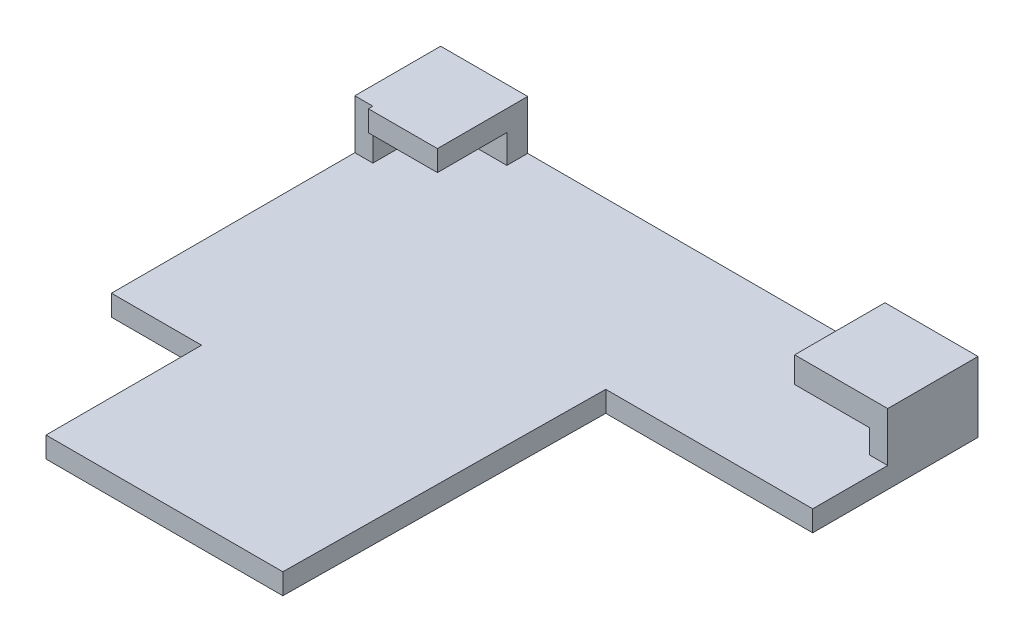
ISO-10303-21;
HEADER;
FILE_DESCRIPTION(('STEP AP214'),'2;1');
FILE_NAME('part.step','',(''),(''),'','','');
FILE_SCHEMA(('AUTOMOTIVE_DESIGN { 1 0 10303 214 1 1 1 1 }'));
ENDSEC;
DATA;
#1=APPLICATION_CONTEXT('core data for automotive mechanical design processes');
#2=APPLICATION_PROTOCOL_DEFINITION('international standard','automotive_design',2000,#1);
#3=PRODUCT_CONTEXT('',#1,'mechanical');
#4=PRODUCT('Part','Part','',(#3));
#5=PRODUCT_RELATED_PRODUCT_CATEGORY('part','',(#4));
#6=PRODUCT_DEFINITION_FORMATION('','',#4);
#7=PRODUCT_DEFINITION_CONTEXT('part definition',#1,'design');
#8=PRODUCT_DEFINITION('design','',#6,#7);
#9=PRODUCT_DEFINITION_SHAPE('','',#8);
#10=(LENGTH_UNIT() NAMED_UNIT(*) SI_UNIT(.MILLI.,.METRE.));
#11=(NAMED_UNIT(*) PLANE_ANGLE_UNIT() SI_UNIT($,.RADIAN.));
#12=(NAMED_UNIT(*) SI_UNIT($,.STERADIAN.) SOLID_ANGLE_UNIT());
#13=UNCERTAINTY_MEASURE_WITH_UNIT(LENGTH_MEASURE(1.E-05),#10,'distance_accuracy_value','');
#14=(GEOMETRIC_REPRESENTATION_CONTEXT(3) GLOBAL_UNCERTAINTY_ASSIGNED_CONTEXT((#13)) GLOBAL_UNIT_ASSIGNED_CONTEXT((#10,
#11,#12)) REPRESENTATION_CONTEXT('',''));
#15=CARTESIAN_POINT('',(0.,0.,0.));
#16=DIRECTION('',(0.,0.,1.));
#17=DIRECTION('',(1.,0.,0.));
#18=AXIS2_PLACEMENT_3D('',#15,#16,#17);
#19=CARTESIAN_POINT('',(-44.839050620517,5.05,-34.6839136920761));
#20=DIRECTION('',(0.,0.,-1.));
#21=DIRECTION('',(-1.,0.,0.));
#22=AXIS2_PLACEMENT_3D('',#19,#20,#21);
#23=PLANE('',#22);
#24=DIRECTION('',(1.,0.,0.));
#25=VECTOR('',#24,1.);
#26=CARTESIAN_POINT('',(-44.839050620517,3.2,-34.6839136920761));
#27=LINE('',#26,#25);
#28=CARTESIAN_POINT('',(-44.839050620517,3.2,-34.6839136920761));
#29=VERTEX_POINT('',#28);
#30=CARTESIAN_POINT('',(-39.439050620517,3.2,-34.6839136920761));
#31=VERTEX_POINT('',#30);
#32=EDGE_CURVE('E208',#29,#31,#27,.T.);
#33=ORIENTED_EDGE('',*,*,#32,.F.);
#34=DIRECTION('',(0.,-1.,0.));
#35=VECTOR('',#34,1.);
#36=CARTESIAN_POINT('',(-44.839050620517,5.05,-34.6839136920761));
#37=LINE('',#36,#35);
#38=CARTESIAN_POINT('',(-44.839050620517,1.5,-34.6839136920761));
#39=VERTEX_POINT('',#38);
#40=EDGE_CURVE('E213',#29,#39,#37,.T.);
#41=ORIENTED_EDGE('',*,*,#40,.T.);
#42=DIRECTION('',(1.,0.,0.));
#43=VECTOR('',#42,1.);
#44=CARTESIAN_POINT('',(-44.839050620517,1.5,-34.6839136920761));
#45=LINE('',#44,#43);
#46=CARTESIAN_POINT('',(-39.439050620517,1.5,-34.6839136920761));
#47=VERTEX_POINT('',#46);
#48=EDGE_CURVE('E249',#39,#47,#45,.T.);
#49=ORIENTED_EDGE('',*,*,#48,.T.);
#50=DIRECTION('',(0.,-1.,0.));
#51=VECTOR('',#50,1.);
#52=CARTESIAN_POINT('',(-39.439050620517,5.05,-34.6839136920761));
#53=LINE('',#52,#51);
#54=EDGE_CURVE('E285',#31,#47,#53,.T.);
#55=ORIENTED_EDGE('',*,*,#54,.F.);
#56=EDGE_LOOP('',(#33,#41,#49,#55));
#57=FACE_BOUND('',#56,.T.);
#58=ADVANCED_FACE('F39',(#57),#23,.F.);
#59=CARTESIAN_POINT('',(-39.439050620517,5.05,-34.6839136920761));
#60=DIRECTION('',(1.,0.,0.));
#61=DIRECTION('',(0.,0.,-1.));
#62=AXIS2_PLACEMENT_3D('',#59,#60,#61);
#63=PLANE('',#62);
#64=DIRECTION('',(0.,0.,-1.));
#65=VECTOR('',#64,1.);
#66=CARTESIAN_POINT('',(-39.439050620517,3.2,-29.6839136920761));
#67=LINE('',#66,#65);
#68=CARTESIAN_POINT('',(-39.439050620517,3.2,-29.6839136920761));
#69=VERTEX_POINT('',#68);
#70=EDGE_CURVE('E195',#69,#31,#67,.T.);
#71=ORIENTED_EDGE('',*,*,#70,.T.);
#72=ORIENTED_EDGE('',*,*,#54,.T.);
#73=DIRECTION('',(0.,0.,1.));
#74=VECTOR('',#73,1.);
#75=CARTESIAN_POINT('',(-39.439050620517,1.5,-34.6839136920761));
#76=LINE('',#75,#74);
#77=CARTESIAN_POINT('',(-39.439050620517,1.5,-29.6839136920761));
#78=VERTEX_POINT('',#77);
#79=EDGE_CURVE('E266',#47,#78,#76,.T.);
#80=ORIENTED_EDGE('',*,*,#79,.T.);
#81=DIRECTION('',(0.,-1.,0.));
#82=VECTOR('',#81,1.);
#83=CARTESIAN_POINT('',(-39.439050620517,5.05,-29.6839136920761));
#84=LINE('',#83,#82);
#85=EDGE_CURVE('E282',#69,#78,#84,.T.);
#86=ORIENTED_EDGE('',*,*,#85,.F.);
#87=EDGE_LOOP('',(#71,#72,#80,#86));
#88=FACE_BOUND('',#87,.T.);
#89=ADVANCED_FACE('F478',(#88),#63,.F.);
#90=CARTESIAN_POINT('',(-70.5591900080508,5.05,-34.6839136920761));
#91=DIRECTION('',(0.,0.,-1.));
#92=DIRECTION('',(-1.,0.,0.));
#93=AXIS2_PLACEMENT_3D('',#90,#91,#92);
#94=PLANE('',#93);
#95=DIRECTION('',(1.,0.,0.));
#96=VECTOR('',#95,1.);
#97=CARTESIAN_POINT('',(-75.5258583786433,3.55,-34.6839136920761));
#98=LINE('',#97,#96);
#99=CARTESIAN_POINT('',(-75.5258583786433,3.55,-34.6839136920761));
#100=VERTEX_POINT('',#99);
#101=CARTESIAN_POINT('',(-70.5591900080508,3.55,-34.6839136920761));
#102=VERTEX_POINT('',#101);
#103=EDGE_CURVE('E215',#100,#102,#98,.T.);
#104=ORIENTED_EDGE('',*,*,#103,.F.);
#105=DIRECTION('',(0.,-1.,0.));
#106=VECTOR('',#105,1.);
#107=CARTESIAN_POINT('',(-75.5258583786433,5.05,-34.6839136920761));
#108=LINE('',#107,#106);
#109=CARTESIAN_POINT('',(-75.5258583786433,1.5,-34.6839136920761));
#110=VERTEX_POINT('',#109);
#111=EDGE_CURVE('E304',#100,#110,#108,.T.);
#112=ORIENTED_EDGE('',*,*,#111,.T.);
#113=DIRECTION('',(1.,0.,0.));
#114=VECTOR('',#113,1.);
#115=CARTESIAN_POINT('',(-70.5591900080508,1.5,-34.6839136920761));
#116=LINE('',#115,#114);
#117=CARTESIAN_POINT('',(-70.5591900080508,1.5,-34.6839136920761));
#118=VERTEX_POINT('',#117);
#119=EDGE_CURVE('E288',#110,#118,#116,.T.);
#120=ORIENTED_EDGE('',*,*,#119,.T.);
#121=DIRECTION('',(0.,-1.,0.));
#122=VECTOR('',#121,1.);
#123=CARTESIAN_POINT('',(-70.5591900080508,5.05,-34.6839136920761));
#124=LINE('',#123,#122);
#125=EDGE_CURVE('E331',#102,#118,#124,.T.);
#126=ORIENTED_EDGE('',*,*,#125,.F.);
#127=EDGE_LOOP('',(#104,#112,#120,#126));
#128=FACE_BOUND('',#127,.T.);
#129=ADVANCED_FACE('F484',(#128),#94,.F.);
#130=CARTESIAN_POINT('',(-75.5258583786433,5.05,-34.6839136920761));
#131=DIRECTION('',(-1.,0.,0.));
#132=DIRECTION('',(0.,0.,1.));
#133=AXIS2_PLACEMENT_3D('',#130,#131,#132);
#134=PLANE('',#133);
#135=DIRECTION('',(0.,0.,-1.));
#136=VECTOR('',#135,1.);
#137=CARTESIAN_POINT('',(-75.5258583786433,3.55,-29.6839136920761));
#138=LINE('',#137,#136);
#139=CARTESIAN_POINT('',(-75.5258583786433,3.55,-30.004194868106));
#140=VERTEX_POINT('',#139);
#141=EDGE_CURVE('E244',#140,#100,#138,.T.);
#142=ORIENTED_EDGE('',*,*,#141,.F.);
#143=DIRECTION('',(0.,-1.,0.));
#144=VECTOR('',#143,1.);
#145=CARTESIAN_POINT('',(-75.5258583786433,5.05,-30.004194868106));
#146=LINE('',#145,#144);
#147=CARTESIAN_POINT('',(-75.5258583786433,1.5,-30.004194868106));
#148=VERTEX_POINT('',#147);
#149=EDGE_CURVE('E63',#140,#148,#146,.T.);
#150=ORIENTED_EDGE('',*,*,#149,.T.);
#151=DIRECTION('',(0.,0.,-1.));
#152=VECTOR('',#151,1.);
#153=CARTESIAN_POINT('',(-75.5258583786433,1.5,-34.6839136920761));
#154=LINE('',#153,#152);
#155=EDGE_CURVE('E293',#148,#110,#154,.T.);
#156=ORIENTED_EDGE('',*,*,#155,.T.);
#157=ORIENTED_EDGE('',*,*,#111,.F.);
#158=EDGE_LOOP('',(#142,#150,#156,#157));
#159=FACE_BOUND('',#158,.T.);
#160=ADVANCED_FACE('F492',(#159),#134,.F.);
#161=CARTESIAN_POINT('',(0.,1.5,0.));
#162=DIRECTION('',(0.,1.,0.));
#163=DIRECTION('',(0.,0.,1.));
#164=AXIS2_PLACEMENT_3D('',#161,#162,#163);
#165=PLANE('',#164);
#166=DIRECTION('',(0.,0.,1.));
#167=VECTOR('',#166,1.);
#168=CARTESIAN_POINT('',(-38.139050620517,1.5,-24.2839136920761));
#169=LINE('',#168,#167);
#170=CARTESIAN_POINT('',(-38.139050620517,1.5,-29.6839136920761));
#171=VERTEX_POINT('',#170);
#172=CARTESIAN_POINT('',(-38.139050620517,1.5,-24.2839136920761));
#173=VERTEX_POINT('',#172);
#174=EDGE_CURVE('E361',#171,#173,#169,.T.);
#175=ORIENTED_EDGE('',*,*,#174,.F.);
#176=DIRECTION('',(1.,0.,0.));
#177=VECTOR('',#176,1.);
#178=CARTESIAN_POINT('',(-39.439050620517,1.5,-29.6839136920761));
#179=LINE('',#178,#177);
#180=EDGE_CURVE('E270',#78,#171,#179,.T.);
#181=ORIENTED_EDGE('',*,*,#180,.F.);
#182=ORIENTED_EDGE('',*,*,#79,.F.);
#183=ORIENTED_EDGE('',*,*,#48,.F.);
#184=DIRECTION('',(0.,0.,1.));
#185=VECTOR('',#184,1.);
#186=CARTESIAN_POINT('',(-44.839050620517,1.5,-36.1839136920761));
#187=LINE('',#186,#185);
#188=CARTESIAN_POINT('',(-44.839050620517,1.5,-36.1839136920761));
#189=VERTEX_POINT('',#188);
#190=EDGE_CURVE('E253',#189,#39,#187,.T.);
#191=ORIENTED_EDGE('',*,*,#190,.F.);
#192=DIRECTION('',(1.,0.,0.));
#193=VECTOR('',#192,1.);
#194=CARTESIAN_POINT('',(-39.639050620517,1.5,-36.1839136920761));
#195=LINE('',#194,#193);
#196=CARTESIAN_POINT('',(-70.5591900080508,1.5,-36.1839136920761));
#197=VERTEX_POINT('',#196);
#198=EDGE_CURVE('E367',#197,#189,#195,.T.);
#199=ORIENTED_EDGE('',*,*,#198,.F.);
#200=DIRECTION('',(0.,0.,-1.));
#201=VECTOR('',#200,1.);
#202=CARTESIAN_POINT('',(-70.5591900080508,1.5,-36.1839136920761));
#203=LINE('',#202,#201);
#204=EDGE_CURVE('E308',#118,#197,#203,.T.);
#205=ORIENTED_EDGE('',*,*,#204,.F.);
#206=ORIENTED_EDGE('',*,*,#119,.F.);
#207=ORIENTED_EDGE('',*,*,#155,.F.);
#208=DIRECTION('',(1.,0.,0.));
#209=VECTOR('',#208,1.);
#210=CARTESIAN_POINT('',(-75.5258583786433,1.5,-30.004194868106));
#211=LINE('',#210,#209);
#212=CARTESIAN_POINT('',(-76.8258583786433,1.5,-30.004194868106));
#213=VERTEX_POINT('',#212);
#214=EDGE_CURVE('E312',#213,#148,#211,.T.);
#215=ORIENTED_EDGE('',*,*,#214,.F.);
#216=DIRECTION('',(0.,0.,-1.));
#217=VECTOR('',#216,1.);
#218=CARTESIAN_POINT('',(-76.8258583786433,1.5,-36.1839136920761));
#219=LINE('',#218,#217);
#220=CARTESIAN_POINT('',(-76.8258583786433,1.5,-12.4839136920761));
#221=VERTEX_POINT('',#220);
#222=EDGE_CURVE('E346',#221,#213,#219,.T.);
#223=ORIENTED_EDGE('',*,*,#222,.F.);
#224=DIRECTION('',(1.,0.,0.));
#225=VECTOR('',#224,1.);
#226=CARTESIAN_POINT('',(-75.339050620517,1.5,-12.4839136920761));
#227=LINE('',#226,#225);
#228=CARTESIAN_POINT('',(-70.339050620517,1.5,-12.4839136920761));
#229=VERTEX_POINT('',#228);
#230=EDGE_CURVE('E372',#221,#229,#227,.T.);
#231=ORIENTED_EDGE('',*,*,#230,.T.);
#232=DIRECTION('',(0.,0.,1.));
#233=VECTOR('',#232,1.);
#234=CARTESIAN_POINT('',(-70.339050620517,1.5,-12.4839136920761));
#235=LINE('',#234,#233);
#236=CARTESIAN_POINT('',(-70.339050620517,1.5,-1.28391369207612));
#237=VERTEX_POINT('',#236);
#238=EDGE_CURVE('E375',#229,#237,#235,.T.);
#239=ORIENTED_EDGE('',*,*,#238,.T.);
#240=DIRECTION('',(1.,0.,0.));
#241=VECTOR('',#240,1.);
#242=CARTESIAN_POINT('',(-70.339050620517,1.5,-1.28391369207612));
#243=LINE('',#242,#241);
#244=CARTESIAN_POINT('',(-53.289050620517,1.5,-1.28391369207612));
#245=VERTEX_POINT('',#244);
#246=EDGE_CURVE('E379',#237,#245,#243,.T.);
#247=ORIENTED_EDGE('',*,*,#246,.T.);
#248=DIRECTION('',(0.010868923168587,0.,-0.999940931510034));
#249=VECTOR('',#248,1.);
#250=CARTESIAN_POINT('',(-53.039050620517,1.5,-24.2839136920761));
#251=LINE('',#250,#249);
#252=CARTESIAN_POINT('',(-53.039050620517,1.5,-24.2839136920761));
#253=VERTEX_POINT('',#252);
#254=EDGE_CURVE('E382',#245,#253,#251,.T.);
#255=ORIENTED_EDGE('',*,*,#254,.T.);
#256=DIRECTION('',(1.,0.,0.));
#257=VECTOR('',#256,1.);
#258=CARTESIAN_POINT('',(-39.639050620517,1.5,-24.2839136920761));
#259=LINE('',#258,#257);
#260=EDGE_CURVE('E385',#253,#173,#259,.T.);
#261=ORIENTED_EDGE('',*,*,#260,.T.);
#262=EDGE_LOOP('',(#175,#181,#182,#183,#191,#199,#205,#206,#207,#215,#223,#231,#239,#247,#255,#261));
#263=FACE_BOUND('',#262,.T.);
#264=ADVANCED_FACE('F435',(#263),#165,.T.);
#265=CARTESIAN_POINT('',(-75.339050620517,1.5,-12.4839136920761));
#266=DIRECTION('',(0.,0.,-1.));
#267=DIRECTION('',(-1.,0.,0.));
#268=AXIS2_PLACEMENT_3D('',#265,#266,#267);
#269=PLANE('',#268);
#270=DIRECTION('',(1.,0.,0.));
#271=VECTOR('',#270,1.);
#272=CARTESIAN_POINT('',(-75.339050620517,0.,-12.4839136920761));
#273=LINE('',#272,#271);
#274=CARTESIAN_POINT('',(-76.8258583786433,0.,-12.4839136920761));
#275=VERTEX_POINT('',#274);
#276=CARTESIAN_POINT('',(-70.339050620517,0.,-12.4839136920761));
#277=VERTEX_POINT('',#276);
#278=EDGE_CURVE('E371',#275,#277,#273,.T.);
#279=ORIENTED_EDGE('',*,*,#278,.T.);
#280=DIRECTION('',(0.,-1.,0.));
#281=VECTOR('',#280,1.);
#282=CARTESIAN_POINT('',(-70.339050620517,1.5,-12.4839136920761));
#283=LINE('',#282,#281);
#284=EDGE_CURVE('E11',#229,#277,#283,.T.);
#285=ORIENTED_EDGE('',*,*,#284,.F.);
#286=ORIENTED_EDGE('',*,*,#230,.F.);
#287=DIRECTION('',(0.,1.,0.));
#288=VECTOR('',#287,1.);
#289=CARTESIAN_POINT('',(-76.8258583786433,1.5,-12.4839136920761));
#290=LINE('',#289,#288);
#291=EDGE_CURVE('E342',#275,#221,#290,.T.);
#292=ORIENTED_EDGE('',*,*,#291,.F.);
#293=EDGE_LOOP('',(#279,#285,#286,#292));
#294=FACE_BOUND('',#293,.T.);
#295=ADVANCED_FACE('F41',(#294),#269,.F.);
#296=CARTESIAN_POINT('',(-70.339050620517,1.5,-12.4839136920761));
#297=DIRECTION('',(1.,0.,0.));
#298=DIRECTION('',(0.,0.,-1.));
#299=AXIS2_PLACEMENT_3D('',#296,#297,#298);
#300=PLANE('',#299);
#301=DIRECTION('',(0.,0.,1.));
#302=VECTOR('',#301,1.);
#303=CARTESIAN_POINT('',(-70.339050620517,0.,-12.4839136920761));
#304=LINE('',#303,#302);
#305=CARTESIAN_POINT('',(-70.339050620517,0.,-1.28391369207612));
#306=VERTEX_POINT('',#305);
#307=EDGE_CURVE('E392',#277,#306,#304,.T.);
#308=ORIENTED_EDGE('',*,*,#307,.T.);
#309=DIRECTION('',(0.,-1.,0.));
#310=VECTOR('',#309,1.);
#311=CARTESIAN_POINT('',(-70.339050620517,1.5,-1.28391369207612));
#312=LINE('',#311,#310);
#313=EDGE_CURVE('E48',#237,#306,#312,.T.);
#314=ORIENTED_EDGE('',*,*,#313,.F.);
#315=ORIENTED_EDGE('',*,*,#238,.F.);
#316=ORIENTED_EDGE('',*,*,#284,.T.);
#317=EDGE_LOOP('',(#308,#314,#315,#316));
#318=FACE_BOUND('',#317,.T.);
#319=ADVANCED_FACE('F439',(#318),#300,.F.);
#320=CARTESIAN_POINT('',(-70.339050620517,1.5,-1.28391369207612));
#321=DIRECTION('',(0.,0.,-1.));
#322=DIRECTION('',(-1.,0.,0.));
#323=AXIS2_PLACEMENT_3D('',#320,#321,#322);
#324=PLANE('',#323);
#325=DIRECTION('',(1.,0.,0.));
#326=VECTOR('',#325,1.);
#327=CARTESIAN_POINT('',(-70.339050620517,0.,-1.28391369207612));
#328=LINE('',#327,#326);
#329=CARTESIAN_POINT('',(-53.289050620517,0.,-1.28391369207612));
#330=VERTEX_POINT('',#329);
#331=EDGE_CURVE('E395',#306,#330,#328,.T.);
#332=ORIENTED_EDGE('',*,*,#331,.T.);
#333=DIRECTION('',(0.,-1.,0.));
#334=VECTOR('',#333,1.);
#335=CARTESIAN_POINT('',(-53.289050620517,1.5,-1.28391369207612));
#336=LINE('',#335,#334);
#337=EDGE_CURVE('E406',#245,#330,#336,.T.);
#338=ORIENTED_EDGE('',*,*,#337,.F.);
#339=ORIENTED_EDGE('',*,*,#246,.F.);
#340=ORIENTED_EDGE('',*,*,#313,.T.);
#341=EDGE_LOOP('',(#332,#338,#339,#340));
#342=FACE_BOUND('',#341,.T.);
#343=ADVANCED_FACE('F415',(#342),#324,.F.);
#344=CARTESIAN_POINT('',(-53.039050620517,1.5,-24.2839136920761));
#345=DIRECTION('',(-0.999940931510034,0.,-0.010868923168587));
#346=DIRECTION('',(-0.010868923168587,0.,0.999940931510035));
#347=AXIS2_PLACEMENT_3D('',#344,#345,#346);
#348=PLANE('',#347);
#349=DIRECTION('',(0.010868923168587,0.,-0.999940931510034));
#350=VECTOR('',#349,1.);
#351=CARTESIAN_POINT('',(-53.039050620517,0.,-24.2839136920761));
#352=LINE('',#351,#350);
#353=CARTESIAN_POINT('',(-53.039050620517,0.,-24.2839136920761));
#354=VERTEX_POINT('',#353);
#355=EDGE_CURVE('E398',#330,#354,#352,.T.);
#356=ORIENTED_EDGE('',*,*,#355,.T.);
#357=DIRECTION('',(0.,-1.,0.));
#358=VECTOR('',#357,1.);
#359=CARTESIAN_POINT('',(-53.039050620517,1.5,-24.2839136920761));
#360=LINE('',#359,#358);
#361=EDGE_CURVE('E389',#253,#354,#360,.T.);
#362=ORIENTED_EDGE('',*,*,#361,.F.);
#363=ORIENTED_EDGE('',*,*,#254,.F.);
#364=ORIENTED_EDGE('',*,*,#337,.T.);
#365=EDGE_LOOP('',(#356,#362,#363,#364));
#366=FACE_BOUND('',#365,.T.);
#367=ADVANCED_FACE('F427',(#366),#348,.F.);
#368=CARTESIAN_POINT('',(-39.639050620517,1.5,-24.2839136920761));
#369=DIRECTION('',(0.,0.,-1.));
#370=DIRECTION('',(-1.,0.,0.));
#371=AXIS2_PLACEMENT_3D('',#368,#369,#370);
#372=PLANE('',#371);
#373=DIRECTION('',(1.,0.,0.));
#374=VECTOR('',#373,1.);
#375=CARTESIAN_POINT('',(-39.639050620517,0.,-24.2839136920761));
#376=LINE('',#375,#374);
#377=CARTESIAN_POINT('',(-38.139050620517,0.,-24.2839136920761));
#378=VERTEX_POINT('',#377);
#379=EDGE_CURVE('E376',#354,#378,#376,.T.);
#380=ORIENTED_EDGE('',*,*,#379,.T.);
#381=DIRECTION('',(0.,-1.,0.));
#382=VECTOR('',#381,1.);
#383=CARTESIAN_POINT('',(-38.139050620517,1.5,-24.2839136920761));
#384=LINE('',#383,#382);
#385=EDGE_CURVE('E350',#173,#378,#384,.T.);
#386=ORIENTED_EDGE('',*,*,#385,.F.);
#387=ORIENTED_EDGE('',*,*,#260,.F.);
#388=ORIENTED_EDGE('',*,*,#361,.T.);
#389=EDGE_LOOP('',(#380,#386,#387,#388));
#390=FACE_BOUND('',#389,.T.);
#391=ADVANCED_FACE('F431',(#390),#372,.F.);
#392=CARTESIAN_POINT('',(0.,0.,0.));
#393=DIRECTION('',(0.,1.,0.));
#394=DIRECTION('',(0.,0.,1.));
#395=AXIS2_PLACEMENT_3D('',#392,#393,#394);
#396=PLANE('',#395);
#397=ORIENTED_EDGE('',*,*,#278,.F.);
#398=DIRECTION('',(0.,0.,1.));
#399=VECTOR('',#398,1.);
#400=CARTESIAN_POINT('',(-76.8258583786433,0.,-36.1839136920761));
#401=LINE('',#400,#399);
#402=CARTESIAN_POINT('',(-76.8258583786433,0.,-36.1839136920761));
#403=VERTEX_POINT('',#402);
#404=EDGE_CURVE('E338',#403,#275,#401,.T.);
#405=ORIENTED_EDGE('',*,*,#404,.F.);
#406=DIRECTION('',(-1.,0.,0.));
#407=VECTOR('',#406,1.);
#408=CARTESIAN_POINT('',(-39.639050620517,0.,-36.1839136920761));
#409=LINE('',#408,#407);
#410=CARTESIAN_POINT('',(-38.139050620517,0.,-36.1839136920761));
#411=VERTEX_POINT('',#410);
#412=EDGE_CURVE('E364',#411,#403,#409,.T.);
#413=ORIENTED_EDGE('',*,*,#412,.F.);
#414=DIRECTION('',(0.,0.,-1.));
#415=VECTOR('',#414,1.);
#416=CARTESIAN_POINT('',(-38.139050620517,0.,-24.2839136920761));
#417=LINE('',#416,#415);
#418=EDGE_CURVE('E354',#378,#411,#417,.T.);
#419=ORIENTED_EDGE('',*,*,#418,.F.);
#420=ORIENTED_EDGE('',*,*,#379,.F.);
#421=ORIENTED_EDGE('',*,*,#355,.F.);
#422=ORIENTED_EDGE('',*,*,#331,.F.);
#423=ORIENTED_EDGE('',*,*,#307,.F.);
#424=EDGE_LOOP('',(#397,#405,#413,#419,#420,#421,#422,#423));
#425=FACE_BOUND('',#424,.T.);
#426=ADVANCED_FACE('F422',(#425),#396,.F.);
#427=CARTESIAN_POINT('',(0.,0.,-36.1839136920761));
#428=DIRECTION('',(0.,0.,-1.));
#429=DIRECTION('',(-1.,0.,0.));
#430=AXIS2_PLACEMENT_3D('',#427,#428,#429);
#431=PLANE('',#430);
#432=DIRECTION('',(0.,-1.,0.));
#433=VECTOR('',#432,1.);
#434=CARTESIAN_POINT('',(-76.8258583786433,1.5,-36.1839136920761));
#435=LINE('',#434,#433);
#436=CARTESIAN_POINT('',(-76.8258583786433,5.05,-36.1839136920761));
#437=VERTEX_POINT('',#436);
#438=EDGE_CURVE('E334',#437,#403,#435,.T.);
#439=ORIENTED_EDGE('',*,*,#438,.F.);
#440=DIRECTION('',(-1.,0.,0.));
#441=VECTOR('',#440,1.);
#442=CARTESIAN_POINT('',(-76.8258583786433,5.05,-36.1839136920761));
#443=LINE('',#442,#441);
#444=CARTESIAN_POINT('',(-70.5591900080508,5.05,-36.1839136920761));
#445=VERTEX_POINT('',#444);
#446=EDGE_CURVE('E292',#445,#437,#443,.T.);
#447=ORIENTED_EDGE('',*,*,#446,.F.);
#448=DIRECTION('',(0.,-1.,0.));
#449=VECTOR('',#448,1.);
#450=CARTESIAN_POINT('',(-70.5591900080508,5.05,-36.1839136920761));
#451=LINE('',#450,#449);
#452=EDGE_CURVE('E327',#445,#197,#451,.T.);
#453=ORIENTED_EDGE('',*,*,#452,.T.);
#454=ORIENTED_EDGE('',*,*,#198,.T.);
#455=DIRECTION('',(0.,-1.,0.));
#456=VECTOR('',#455,1.);
#457=CARTESIAN_POINT('',(-44.839050620517,5.05,-36.1839136920761));
#458=LINE('',#457,#456);
#459=CARTESIAN_POINT('',(-44.839050620517,5.05,-36.1839136920761));
#460=VERTEX_POINT('',#459);
#461=EDGE_CURVE('E277',#460,#189,#458,.T.);
#462=ORIENTED_EDGE('',*,*,#461,.F.);
#463=DIRECTION('',(-1.,0.,0.));
#464=VECTOR('',#463,1.);
#465=CARTESIAN_POINT('',(-38.139050620517,5.05,-36.1839136920761));
#466=LINE('',#465,#464);
#467=CARTESIAN_POINT('',(-38.139050620517,5.05,-36.1839136920761));
#468=VERTEX_POINT('',#467);
#469=EDGE_CURVE('E257',#468,#460,#466,.T.);
#470=ORIENTED_EDGE('',*,*,#469,.F.);
#471=DIRECTION('',(0.,1.,0.));
#472=VECTOR('',#471,1.);
#473=CARTESIAN_POINT('',(-38.139050620517,1.5,-36.1839136920761));
#474=LINE('',#473,#472);
#475=EDGE_CURVE('E358',#411,#468,#474,.T.);
#476=ORIENTED_EDGE('',*,*,#475,.F.);
#477=ORIENTED_EDGE('',*,*,#412,.T.);
#478=EDGE_LOOP('',(#439,#447,#453,#454,#462,#470,#476,#477));
#479=FACE_BOUND('',#478,.T.);
#480=ADVANCED_FACE('F449',(#479),#431,.T.);
#481=CARTESIAN_POINT('',(-38.139050620517,0.,0.));
#482=DIRECTION('',(1.,0.,0.));
#483=DIRECTION('',(0.,0.,-1.));
#484=AXIS2_PLACEMENT_3D('',#481,#482,#483);
#485=PLANE('',#484);
#486=ORIENTED_EDGE('',*,*,#385,.T.);
#487=ORIENTED_EDGE('',*,*,#418,.T.);
#488=ORIENTED_EDGE('',*,*,#475,.T.);
#489=DIRECTION('',(0.,0.,-1.));
#490=VECTOR('',#489,1.);
#491=CARTESIAN_POINT('',(-38.139050620517,5.05,-29.6839136920761));
#492=LINE('',#491,#490);
#493=CARTESIAN_POINT('',(-38.139050620517,5.05,-29.6839136920761));
#494=VERTEX_POINT('',#493);
#495=EDGE_CURVE('E252',#494,#468,#492,.T.);
#496=ORIENTED_EDGE('',*,*,#495,.F.);
#497=DIRECTION('',(0.,-1.,0.));
#498=VECTOR('',#497,1.);
#499=CARTESIAN_POINT('',(-38.139050620517,5.05,-29.6839136920761));
#500=LINE('',#499,#498);
#501=EDGE_CURVE('E55',#494,#171,#500,.T.);
#502=ORIENTED_EDGE('',*,*,#501,.T.);
#503=ORIENTED_EDGE('',*,*,#174,.T.);
#504=EDGE_LOOP('',(#486,#487,#488,#496,#502,#503));
#505=FACE_BOUND('',#504,.T.);
#506=ADVANCED_FACE('F468',(#505),#485,.T.);
#507=CARTESIAN_POINT('',(-76.8258583786433,0.,0.));
#508=DIRECTION('',(-1.,0.,0.));
#509=DIRECTION('',(0.,0.,1.));
#510=AXIS2_PLACEMENT_3D('',#507,#508,#509);
#511=PLANE('',#510);
#512=ORIENTED_EDGE('',*,*,#438,.T.);
#513=ORIENTED_EDGE('',*,*,#404,.T.);
#514=ORIENTED_EDGE('',*,*,#291,.T.);
#515=ORIENTED_EDGE('',*,*,#222,.T.);
#516=DIRECTION('',(0.,-1.,0.));
#517=VECTOR('',#516,1.);
#518=CARTESIAN_POINT('',(-76.8258583786433,5.05,-30.004194868106));
#519=LINE('',#518,#517);
#520=CARTESIAN_POINT('',(-76.8258583786433,5.05,-30.004194868106));
#521=VERTEX_POINT('',#520);
#522=EDGE_CURVE('E323',#521,#213,#519,.T.);
#523=ORIENTED_EDGE('',*,*,#522,.F.);
#524=DIRECTION('',(0.,0.,1.));
#525=VECTOR('',#524,1.);
#526=CARTESIAN_POINT('',(-76.8258583786433,5.05,-30.004194868106));
#527=LINE('',#526,#525);
#528=EDGE_CURVE('E297',#437,#521,#527,.T.);
#529=ORIENTED_EDGE('',*,*,#528,.F.);
#530=EDGE_LOOP('',(#512,#513,#514,#515,#523,#529));
#531=FACE_BOUND('',#530,.T.);
#532=ADVANCED_FACE('F444',(#531),#511,.T.);
#533=CARTESIAN_POINT('',(-70.5591900080508,5.05,-36.1839136920761));
#534=DIRECTION('',(-1.,0.,0.));
#535=DIRECTION('',(0.,0.,1.));
#536=AXIS2_PLACEMENT_3D('',#533,#534,#535);
#537=PLANE('',#536);
#538=ORIENTED_EDGE('',*,*,#204,.T.);
#539=ORIENTED_EDGE('',*,*,#452,.F.);
#540=DIRECTION('',(0.,0.,-1.));
#541=VECTOR('',#540,1.);
#542=CARTESIAN_POINT('',(-70.5591900080508,5.05,-36.1839136920761));
#543=LINE('',#542,#541);
#544=CARTESIAN_POINT('',(-70.5591900080508,5.05,-29.6839136920761));
#545=VERTEX_POINT('',#544);
#546=EDGE_CURVE('E289',#545,#445,#543,.T.);
#547=ORIENTED_EDGE('',*,*,#546,.F.);
#548=DIRECTION('',(0.,1.,0.));
#549=VECTOR('',#548,1.);
#550=CARTESIAN_POINT('',(-70.5591900080508,5.05,-29.6839136920761));
#551=LINE('',#550,#549);
#552=CARTESIAN_POINT('',(-70.5591900080508,3.55,-29.6839136920761));
#553=VERTEX_POINT('',#552);
#554=EDGE_CURVE('E230',#553,#545,#551,.T.);
#555=ORIENTED_EDGE('',*,*,#554,.F.);
#556=DIRECTION('',(0.,0.,-1.));
#557=VECTOR('',#556,1.);
#558=CARTESIAN_POINT('',(-70.5591900080508,3.55,-29.6839136920761));
#559=LINE('',#558,#557);
#560=EDGE_CURVE('E240',#553,#102,#559,.T.);
#561=ORIENTED_EDGE('',*,*,#560,.T.);
#562=ORIENTED_EDGE('',*,*,#125,.T.);
#563=EDGE_LOOP('',(#538,#539,#547,#555,#561,#562));
#564=FACE_BOUND('',#563,.T.);
#565=ADVANCED_FACE('F458',(#564),#537,.F.);
#566=CARTESIAN_POINT('',(-75.5258583786433,5.05,-30.004194868106));
#567=DIRECTION('',(0.,0.,-1.));
#568=DIRECTION('',(-1.,0.,0.));
#569=AXIS2_PLACEMENT_3D('',#566,#567,#568);
#570=PLANE('',#569);
#571=ORIENTED_EDGE('',*,*,#214,.T.);
#572=ORIENTED_EDGE('',*,*,#149,.F.);
#573=CARTESIAN_POINT('',(-75.5258583786433,5.05,-30.004194868106));
#574=VERTEX_POINT('',#573);
#575=EDGE_CURVE('E320',#574,#140,#146,.T.);
#576=ORIENTED_EDGE('',*,*,#575,.F.);
#577=DIRECTION('',(1.,0.,0.));
#578=VECTOR('',#577,1.);
#579=CARTESIAN_POINT('',(-75.5258583786433,5.05,-30.004194868106));
#580=LINE('',#579,#578);
#581=EDGE_CURVE('E300',#521,#574,#580,.T.);
#582=ORIENTED_EDGE('',*,*,#581,.F.);
#583=ORIENTED_EDGE('',*,*,#522,.T.);
#584=EDGE_LOOP('',(#571,#572,#576,#582,#583));
#585=FACE_BOUND('',#584,.T.);
#586=ADVANCED_FACE('F491',(#585),#570,.F.);
#587=CARTESIAN_POINT('',(0.,5.05,0.));
#588=DIRECTION('',(0.,1.,0.));
#589=DIRECTION('',(0.,0.,1.));
#590=AXIS2_PLACEMENT_3D('',#587,#588,#589);
#591=PLANE('',#590);
#592=ORIENTED_EDGE('',*,*,#581,.T.);
#593=DIRECTION('',(0.,0.,-1.));
#594=VECTOR('',#593,1.);
#595=CARTESIAN_POINT('',(-75.5258583786433,5.05,-29.6839136920761));
#596=LINE('',#595,#594);
#597=CARTESIAN_POINT('',(-75.5258583786433,5.05,-29.6839136920761));
#598=VERTEX_POINT('',#597);
#599=EDGE_CURVE('E236',#598,#574,#596,.T.);
#600=ORIENTED_EDGE('',*,*,#599,.F.);
#601=DIRECTION('',(-1.,0.,0.));
#602=VECTOR('',#601,1.);
#603=CARTESIAN_POINT('',(-75.5258583786433,5.05,-29.6839136920761));
#604=LINE('',#603,#602);
#605=EDGE_CURVE('E234',#545,#598,#604,.T.);
#606=ORIENTED_EDGE('',*,*,#605,.F.);
#607=ORIENTED_EDGE('',*,*,#546,.T.);
#608=ORIENTED_EDGE('',*,*,#446,.T.);
#609=ORIENTED_EDGE('',*,*,#528,.T.);
#610=EDGE_LOOP('',(#592,#600,#606,#607,#608,#609));
#611=FACE_BOUND('',#610,.T.);
#612=ADVANCED_FACE('F452',(#611),#591,.T.);
#613=CARTESIAN_POINT('',(-39.439050620517,5.05,-29.6839136920761));
#614=DIRECTION('',(0.,0.,-1.));
#615=DIRECTION('',(-1.,0.,0.));
#616=AXIS2_PLACEMENT_3D('',#613,#614,#615);
#617=PLANE('',#616);
#618=ORIENTED_EDGE('',*,*,#180,.T.);
#619=ORIENTED_EDGE('',*,*,#501,.F.);
#620=DIRECTION('',(1.,0.,0.));
#621=VECTOR('',#620,1.);
#622=CARTESIAN_POINT('',(-39.439050620517,5.05,-29.6839136920761));
#623=LINE('',#622,#621);
#624=CARTESIAN_POINT('',(-44.839050620517,5.05,-29.6839136920761));
#625=VERTEX_POINT('',#624);
#626=EDGE_CURVE('E203',#625,#494,#623,.T.);
#627=ORIENTED_EDGE('',*,*,#626,.F.);
#628=DIRECTION('',(0.,-1.,0.));
#629=VECTOR('',#628,1.);
#630=CARTESIAN_POINT('',(-44.839050620517,5.05,-29.6839136920761));
#631=LINE('',#630,#629);
#632=CARTESIAN_POINT('',(-44.839050620517,3.2,-29.6839136920761));
#633=VERTEX_POINT('',#632);
#634=EDGE_CURVE('E199',#625,#633,#631,.T.);
#635=ORIENTED_EDGE('',*,*,#634,.T.);
#636=DIRECTION('',(1.,0.,0.));
#637=VECTOR('',#636,1.);
#638=CARTESIAN_POINT('',(-44.839050620517,3.2,-29.6839136920761));
#639=LINE('',#638,#637);
#640=EDGE_CURVE('E188',#633,#69,#639,.T.);
#641=ORIENTED_EDGE('',*,*,#640,.T.);
#642=ORIENTED_EDGE('',*,*,#85,.T.);
#643=EDGE_LOOP('',(#618,#619,#627,#635,#641,#642));
#644=FACE_BOUND('',#643,.T.);
#645=ADVANCED_FACE('F202',(#644),#617,.F.);
#646=CARTESIAN_POINT('',(-44.839050620517,5.05,-36.1839136920761));
#647=DIRECTION('',(1.,0.,0.));
#648=DIRECTION('',(0.,0.,-1.));
#649=AXIS2_PLACEMENT_3D('',#646,#647,#648);
#650=PLANE('',#649);
#651=ORIENTED_EDGE('',*,*,#190,.T.);
#652=ORIENTED_EDGE('',*,*,#40,.F.);
#653=DIRECTION('',(0.,0.,-1.));
#654=VECTOR('',#653,1.);
#655=CARTESIAN_POINT('',(-44.839050620517,3.2,-29.6839136920761));
#656=LINE('',#655,#654);
#657=EDGE_CURVE('E192',#633,#29,#656,.T.);
#658=ORIENTED_EDGE('',*,*,#657,.F.);
#659=ORIENTED_EDGE('',*,*,#634,.F.);
#660=DIRECTION('',(0.,0.,1.));
#661=VECTOR('',#660,1.);
#662=CARTESIAN_POINT('',(-44.839050620517,5.05,-36.1839136920761));
#663=LINE('',#662,#661);
#664=EDGE_CURVE('E260',#460,#625,#663,.T.);
#665=ORIENTED_EDGE('',*,*,#664,.F.);
#666=ORIENTED_EDGE('',*,*,#461,.T.);
#667=EDGE_LOOP('',(#651,#652,#658,#659,#665,#666));
#668=FACE_BOUND('',#667,.T.);
#669=ADVANCED_FACE('F212',(#668),#650,.F.);
#670=CARTESIAN_POINT('',(0.,5.05,0.));
#671=DIRECTION('',(0.,-1.,0.));
#672=DIRECTION('',(0.,0.,-1.));
#673=AXIS2_PLACEMENT_3D('',#670,#671,#672);
#674=PLANE('',#673);
#675=ORIENTED_EDGE('',*,*,#664,.T.);
#676=ORIENTED_EDGE('',*,*,#626,.T.);
#677=ORIENTED_EDGE('',*,*,#495,.T.);
#678=ORIENTED_EDGE('',*,*,#469,.T.);
#679=EDGE_LOOP('',(#675,#676,#677,#678));
#680=FACE_BOUND('',#679,.T.);
#681=ADVANCED_FACE('F467',(#680),#674,.F.);
#682=CARTESIAN_POINT('',(-75.5258583786433,5.05,-29.6839136920761));
#683=DIRECTION('',(1.,0.,0.));
#684=DIRECTION('',(0.,0.,-1.));
#685=AXIS2_PLACEMENT_3D('',#682,#683,#684);
#686=PLANE('',#685);
#687=ORIENTED_EDGE('',*,*,#599,.T.);
#688=ORIENTED_EDGE('',*,*,#575,.T.);
#689=CARTESIAN_POINT('',(-75.5258583786433,3.55,-29.6839136920761));
#690=VERTEX_POINT('',#689);
#691=EDGE_CURVE('E245',#690,#140,#138,.T.);
#692=ORIENTED_EDGE('',*,*,#691,.F.);
#693=DIRECTION('',(0.,-1.,0.));
#694=VECTOR('',#693,1.);
#695=CARTESIAN_POINT('',(-75.5258583786433,5.05,-29.6839136920761));
#696=LINE('',#695,#694);
#697=EDGE_CURVE('E219',#598,#690,#696,.T.);
#698=ORIENTED_EDGE('',*,*,#697,.F.);
#699=EDGE_LOOP('',(#687,#688,#692,#698));
#700=FACE_BOUND('',#699,.T.);
#701=ADVANCED_FACE('F514',(#700),#686,.F.);
#702=CARTESIAN_POINT('',(-75.5258583786433,3.55,-29.6839136920761));
#703=DIRECTION('',(0.,1.,0.));
#704=DIRECTION('',(0.,0.,1.));
#705=AXIS2_PLACEMENT_3D('',#702,#703,#704);
#706=PLANE('',#705);
#707=ORIENTED_EDGE('',*,*,#103,.T.);
#708=ORIENTED_EDGE('',*,*,#560,.F.);
#709=DIRECTION('',(1.,0.,0.));
#710=VECTOR('',#709,1.);
#711=CARTESIAN_POINT('',(-75.5258583786433,3.55,-29.6839136920761));
#712=LINE('',#711,#710);
#713=EDGE_CURVE('E227',#690,#553,#712,.T.);
#714=ORIENTED_EDGE('',*,*,#713,.F.);
#715=ORIENTED_EDGE('',*,*,#691,.T.);
#716=ORIENTED_EDGE('',*,*,#141,.T.);
#717=EDGE_LOOP('',(#707,#708,#714,#715,#716));
#718=FACE_BOUND('',#717,.T.);
#719=ADVANCED_FACE('F517',(#718),#706,.F.);
#720=CARTESIAN_POINT('',(0.,0.,-29.6839136920761));
#721=DIRECTION('',(0.,0.,1.));
#722=DIRECTION('',(1.,0.,0.));
#723=AXIS2_PLACEMENT_3D('',#720,#721,#722);
#724=PLANE('',#723);
#725=ORIENTED_EDGE('',*,*,#697,.T.);
#726=ORIENTED_EDGE('',*,*,#713,.T.);
#727=ORIENTED_EDGE('',*,*,#554,.T.);
#728=ORIENTED_EDGE('',*,*,#605,.T.);
#729=EDGE_LOOP('',(#725,#726,#727,#728));
#730=FACE_BOUND('',#729,.T.);
#731=ADVANCED_FACE('F516',(#730),#724,.T.);
#732=CARTESIAN_POINT('',(-44.839050620517,3.2,-29.6839136920761));
#733=DIRECTION('',(0.,1.,0.));
#734=DIRECTION('',(0.,0.,1.));
#735=AXIS2_PLACEMENT_3D('',#732,#733,#734);
#736=PLANE('',#735);
#737=ORIENTED_EDGE('',*,*,#32,.T.);
#738=ORIENTED_EDGE('',*,*,#70,.F.);
#739=ORIENTED_EDGE('',*,*,#640,.F.);
#740=ORIENTED_EDGE('',*,*,#657,.T.);
#741=EDGE_LOOP('',(#737,#738,#739,#740));
#742=FACE_BOUND('',#741,.T.);
#743=ADVANCED_FACE('F190',(#742),#736,.F.);
#744=CLOSED_SHELL('',(#58,#89,#129,#160,#264,#295,#319,#343,#367,#391,#426,#480,#506,#532,#565,
#586,#612,#645,#669,#681,#701,#719,#731,#743));
#745=MANIFOLD_SOLID_BREP('B2',#744);
#746=ADVANCED_BREP_SHAPE_REPRESENTATION('',(#18,#745),#14);
#747=SHAPE_DEFINITION_REPRESENTATION(#9,#746);
ENDSEC;
END-ISO-10303-21;
